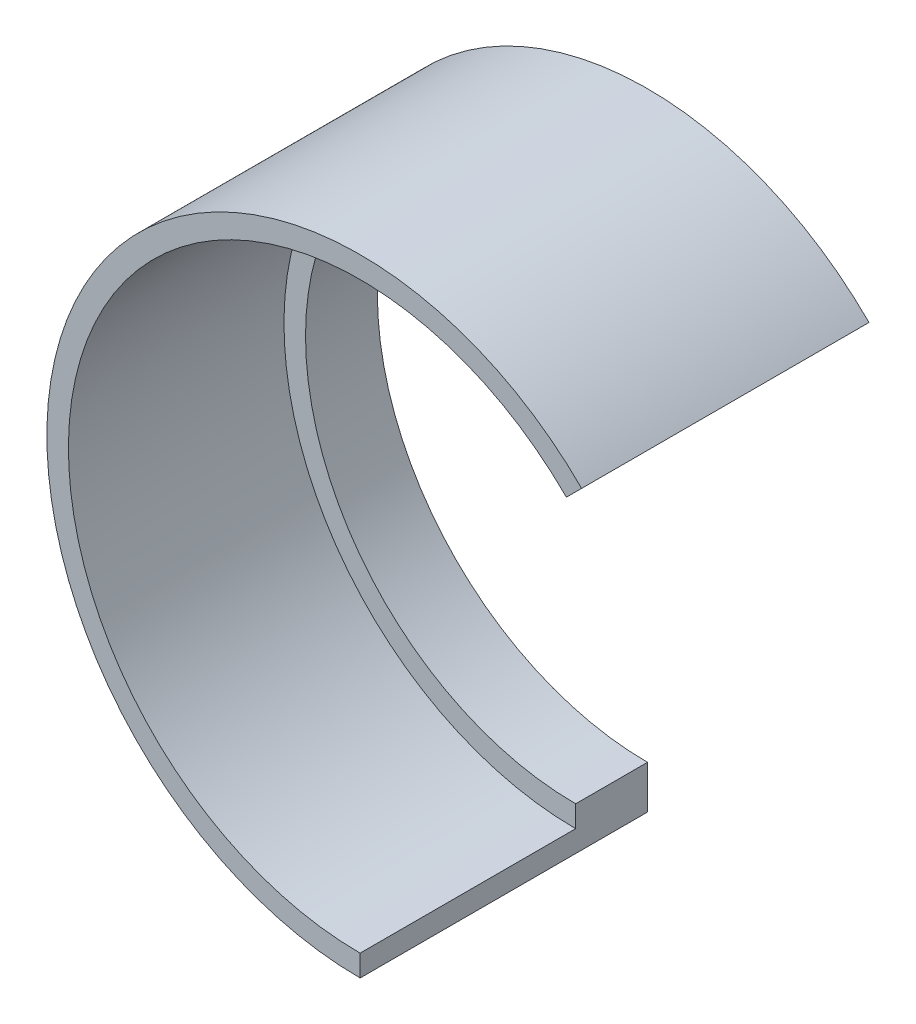
ISO-10303-21;
HEADER;
FILE_DESCRIPTION(('STEP AP214'),'2;1');
FILE_NAME('part.step','',(''),(''),'','','');
FILE_SCHEMA(('AUTOMOTIVE_DESIGN { 1 0 10303 214 1 1 1 1 }'));
ENDSEC;
DATA;
#1=APPLICATION_CONTEXT('core data for automotive mechanical design processes');
#2=APPLICATION_PROTOCOL_DEFINITION('international standard','automotive_design',2000,#1);
#3=PRODUCT_CONTEXT('',#1,'mechanical');
#4=PRODUCT('Part','Part','',(#3));
#5=PRODUCT_RELATED_PRODUCT_CATEGORY('part','',(#4));
#6=PRODUCT_DEFINITION_FORMATION('','',#4);
#7=PRODUCT_DEFINITION_CONTEXT('part definition',#1,'design');
#8=PRODUCT_DEFINITION('design','',#6,#7);
#9=PRODUCT_DEFINITION_SHAPE('','',#8);
#10=(LENGTH_UNIT() NAMED_UNIT(*) SI_UNIT(.MILLI.,.METRE.));
#11=(NAMED_UNIT(*) PLANE_ANGLE_UNIT() SI_UNIT($,.RADIAN.));
#12=(NAMED_UNIT(*) SI_UNIT($,.STERADIAN.) SOLID_ANGLE_UNIT());
#13=UNCERTAINTY_MEASURE_WITH_UNIT(LENGTH_MEASURE(1.E-05),#10,'distance_accuracy_value','');
#14=(GEOMETRIC_REPRESENTATION_CONTEXT(3) GLOBAL_UNCERTAINTY_ASSIGNED_CONTEXT((#13)) GLOBAL_UNIT_ASSIGNED_CONTEXT((#10,
#11,#12)) REPRESENTATION_CONTEXT('',''));
#15=CARTESIAN_POINT('',(0.,0.,0.));
#16=DIRECTION('',(0.,0.,1.));
#17=DIRECTION('',(1.,0.,0.));
#18=AXIS2_PLACEMENT_3D('',#15,#16,#17);
#19=CARTESIAN_POINT('',(0.,0.,10.));
#20=DIRECTION('',(-0.707106781186551,0.707106781186544,0.));
#21=DIRECTION('',(-0.707106781186544,-0.707106781186551,0.));
#22=AXIS2_PLACEMENT_3D('',#19,#20,#21);
#23=PLANE('',#22);
#24=DIRECTION('',(0.707106781186544,0.707106781186551,0.));
#25=VECTOR('',#24,1.);
#26=CARTESIAN_POINT('',(0.,0.,0.));
#27=LINE('',#26,#25);
#28=CARTESIAN_POINT('',(26.587214972614,26.5872149726143,0.));
#29=VERTEX_POINT('',#28);
#30=CARTESIAN_POINT('',(30.8298556597333,30.8298556597336,0.));
#31=VERTEX_POINT('',#30);
#32=EDGE_CURVE('E74',#29,#31,#27,.T.);
#33=ORIENTED_EDGE('',*,*,#32,.T.);
#34=DIRECTION('',(0.,0.,1.));
#35=VECTOR('',#34,1.);
#36=CARTESIAN_POINT('',(30.8298556597333,30.8298556597336,-114.645730027458));
#37=LINE('',#36,#35);
#38=CARTESIAN_POINT('',(30.8298556597333,30.8298556597336,40.));
#39=VERTEX_POINT('',#38);
#40=EDGE_CURVE('E116',#31,#39,#37,.T.);
#41=ORIENTED_EDGE('',*,*,#40,.T.);
#42=DIRECTION('',(0.707106781186543,0.707106781186552,0.));
#43=VECTOR('',#42,1.);
#44=CARTESIAN_POINT('',(0.,0.,40.));
#45=LINE('',#44,#43);
#46=CARTESIAN_POINT('',(28.7085353161737,28.708535316174,40.));
#47=VERTEX_POINT('',#46);
#48=EDGE_CURVE('E222',#47,#39,#45,.T.);
#49=ORIENTED_EDGE('',*,*,#48,.F.);
#50=DIRECTION('',(0.,0.,1.));
#51=VECTOR('',#50,1.);
#52=CARTESIAN_POINT('',(28.7085353161737,28.708535316174,-114.645730027458));
#53=LINE('',#52,#51);
#54=CARTESIAN_POINT('',(28.7085353161737,28.708535316174,10.));
#55=VERTEX_POINT('',#54);
#56=EDGE_CURVE('E110',#55,#47,#53,.T.);
#57=ORIENTED_EDGE('',*,*,#56,.F.);
#58=DIRECTION('',(0.707106781186544,0.707106781186551,0.));
#59=VECTOR('',#58,1.);
#60=CARTESIAN_POINT('',(0.,0.,10.));
#61=LINE('',#60,#59);
#62=CARTESIAN_POINT('',(26.587214972614,26.5872149726143,10.));
#63=VERTEX_POINT('',#62);
#64=EDGE_CURVE('E91',#63,#55,#61,.T.);
#65=ORIENTED_EDGE('',*,*,#64,.F.);
#66=DIRECTION('',(0.,0.,-1.));
#67=VECTOR('',#66,1.);
#68=CARTESIAN_POINT('',(26.587214972614,26.5872149726143,10.));
#69=LINE('',#68,#67);
#70=EDGE_CURVE('E51',#63,#29,#69,.T.);
#71=ORIENTED_EDGE('',*,*,#70,.T.);
#72=EDGE_LOOP('',(#33,#41,#49,#57,#65,#71));
#73=FACE_BOUND('',#72,.T.);
#74=ADVANCED_FACE('F43',(#73),#23,.F.);
#75=CARTESIAN_POINT('',(0.,0.,10.));
#76=DIRECTION('',(1.,0.,0.));
#77=DIRECTION('',(0.,0.,-1.));
#78=AXIS2_PLACEMENT_3D('',#75,#76,#77);
#79=PLANE('',#78);
#80=DIRECTION('',(0.,-1.,0.));
#81=VECTOR('',#80,1.);
#82=CARTESIAN_POINT('',(0.,0.,0.));
#83=LINE('',#82,#81);
#84=CARTESIAN_POINT('',(0.,-37.6,0.));
#85=VERTEX_POINT('',#84);
#86=CARTESIAN_POINT('',(0.,-43.6,0.));
#87=VERTEX_POINT('',#86);
#88=EDGE_CURVE('E126',#85,#87,#83,.T.);
#89=ORIENTED_EDGE('',*,*,#88,.F.);
#90=DIRECTION('',(0.,0.,-1.));
#91=VECTOR('',#90,1.);
#92=CARTESIAN_POINT('',(0.,-37.6,10.));
#93=LINE('',#92,#91);
#94=CARTESIAN_POINT('',(0.,-37.6,10.));
#95=VERTEX_POINT('',#94);
#96=EDGE_CURVE('E11',#95,#85,#93,.T.);
#97=ORIENTED_EDGE('',*,*,#96,.F.);
#98=DIRECTION('',(0.,-1.,0.));
#99=VECTOR('',#98,1.);
#100=CARTESIAN_POINT('',(0.,0.,10.));
#101=LINE('',#100,#99);
#102=CARTESIAN_POINT('',(0.,-40.6,10.));
#103=VERTEX_POINT('',#102);
#104=EDGE_CURVE('E90',#95,#103,#101,.T.);
#105=ORIENTED_EDGE('',*,*,#104,.T.);
#106=DIRECTION('',(0.,0.,1.));
#107=VECTOR('',#106,1.);
#108=CARTESIAN_POINT('',(0.,-40.6,-114.645730027458));
#109=LINE('',#108,#107);
#110=CARTESIAN_POINT('',(0.,-40.6,40.));
#111=VERTEX_POINT('',#110);
#112=EDGE_CURVE('E102',#103,#111,#109,.T.);
#113=ORIENTED_EDGE('',*,*,#112,.T.);
#114=DIRECTION('',(0.,-1.,0.));
#115=VECTOR('',#114,1.);
#116=CARTESIAN_POINT('',(0.,0.,40.));
#117=LINE('',#116,#115);
#118=CARTESIAN_POINT('',(0.,-43.6,40.));
#119=VERTEX_POINT('',#118);
#120=EDGE_CURVE('E228',#111,#119,#117,.T.);
#121=ORIENTED_EDGE('',*,*,#120,.T.);
#122=DIRECTION('',(0.,0.,1.));
#123=VECTOR('',#122,1.);
#124=CARTESIAN_POINT('',(0.,-43.6,-114.645730027458));
#125=LINE('',#124,#123);
#126=EDGE_CURVE('E111',#87,#119,#125,.T.);
#127=ORIENTED_EDGE('',*,*,#126,.F.);
#128=EDGE_LOOP('',(#89,#97,#105,#113,#121,#127));
#129=FACE_BOUND('',#128,.T.);
#130=ADVANCED_FACE('F99',(#129),#79,.T.);
#131=CARTESIAN_POINT('',(0.,0.,10.));
#132=DIRECTION('',(0.,0.,-1.));
#133=DIRECTION('',(-1.,0.,0.));
#134=AXIS2_PLACEMENT_3D('',#131,#132,#133);
#135=CYLINDRICAL_SURFACE('',#134,37.6);
#136=CARTESIAN_POINT('',(0.,0.,0.));
#137=DIRECTION('',(0.,0.,1.));
#138=DIRECTION('',(1.,0.,0.));
#139=AXIS2_PLACEMENT_3D('',#136,#137,#138);
#140=CIRCLE('',#139,37.6);
#141=EDGE_CURVE('E122',#29,#85,#140,.T.);
#142=ORIENTED_EDGE('',*,*,#141,.F.);
#143=ORIENTED_EDGE('',*,*,#70,.F.);
#144=CARTESIAN_POINT('',(0.,0.,10.));
#145=DIRECTION('',(0.,0.,1.));
#146=DIRECTION('',(1.,0.,0.));
#147=AXIS2_PLACEMENT_3D('',#144,#145,#146);
#148=CIRCLE('',#147,37.6);
#149=EDGE_CURVE('E104',#63,#95,#148,.T.);
#150=ORIENTED_EDGE('',*,*,#149,.T.);
#151=ORIENTED_EDGE('',*,*,#96,.T.);
#152=EDGE_LOOP('',(#142,#143,#150,#151));
#153=FACE_BOUND('',#152,.T.);
#154=ADVANCED_FACE('F133',(#153),#135,.F.);
#155=CARTESIAN_POINT('',(0.,0.,10.));
#156=DIRECTION('',(0.,0.,1.));
#157=DIRECTION('',(1.,0.,0.));
#158=AXIS2_PLACEMENT_3D('',#155,#156,#157);
#159=PLANE('',#158);
#160=ORIENTED_EDGE('',*,*,#64,.T.);
#161=CARTESIAN_POINT('',(0.,0.,10.));
#162=DIRECTION('',(0.,0.,1.));
#163=DIRECTION('',(1.,0.,0.));
#164=AXIS2_PLACEMENT_3D('',#161,#162,#163);
#165=CIRCLE('',#164,40.6);
#166=EDGE_CURVE('E86',#55,#103,#165,.T.);
#167=ORIENTED_EDGE('',*,*,#166,.T.);
#168=ORIENTED_EDGE('',*,*,#104,.F.);
#169=ORIENTED_EDGE('',*,*,#149,.F.);
#170=EDGE_LOOP('',(#160,#167,#168,#169));
#171=FACE_BOUND('',#170,.T.);
#172=ADVANCED_FACE('F88',(#171),#159,.T.);
#173=CARTESIAN_POINT('',(0.,0.,0.));
#174=DIRECTION('',(0.,0.,1.));
#175=DIRECTION('',(1.,0.,0.));
#176=AXIS2_PLACEMENT_3D('',#173,#174,#175);
#177=PLANE('',#176);
#178=ORIENTED_EDGE('',*,*,#32,.F.);
#179=ORIENTED_EDGE('',*,*,#141,.T.);
#180=ORIENTED_EDGE('',*,*,#88,.T.);
#181=CARTESIAN_POINT('',(0.,0.,0.));
#182=DIRECTION('',(0.,0.,1.));
#183=DIRECTION('',(1.,0.,0.));
#184=AXIS2_PLACEMENT_3D('',#181,#182,#183);
#185=CIRCLE('',#184,43.6);
#186=EDGE_CURVE('E113',#87,#31,#185,.F.);
#187=ORIENTED_EDGE('',*,*,#186,.T.);
#188=EDGE_LOOP('',(#178,#179,#180,#187));
#189=FACE_BOUND('',#188,.T.);
#190=ADVANCED_FACE('F130',(#189),#177,.F.);
#191=CARTESIAN_POINT('',(0.,0.,-114.645730027458));
#192=DIRECTION('',(0.,0.,1.));
#193=DIRECTION('',(1.,0.,0.));
#194=AXIS2_PLACEMENT_3D('',#191,#192,#193);
#195=CYLINDRICAL_SURFACE('',#194,40.6);
#196=ORIENTED_EDGE('',*,*,#166,.F.);
#197=ORIENTED_EDGE('',*,*,#56,.T.);
#198=CARTESIAN_POINT('',(0.,0.,40.));
#199=DIRECTION('',(0.,0.,1.));
#200=DIRECTION('',(1.,0.,0.));
#201=AXIS2_PLACEMENT_3D('',#198,#199,#200);
#202=CIRCLE('',#201,40.6);
#203=EDGE_CURVE('E109',#47,#111,#202,.T.);
#204=ORIENTED_EDGE('',*,*,#203,.T.);
#205=ORIENTED_EDGE('',*,*,#112,.F.);
#206=EDGE_LOOP('',(#196,#197,#204,#205));
#207=FACE_BOUND('',#206,.T.);
#208=ADVANCED_FACE('F107',(#207),#195,.F.);
#209=CARTESIAN_POINT('',(0.,0.,-114.645730027458));
#210=DIRECTION('',(0.,0.,1.));
#211=DIRECTION('',(1.,0.,0.));
#212=AXIS2_PLACEMENT_3D('',#209,#210,#211);
#213=CYLINDRICAL_SURFACE('',#212,43.6);
#214=ORIENTED_EDGE('',*,*,#186,.F.);
#215=ORIENTED_EDGE('',*,*,#126,.T.);
#216=CARTESIAN_POINT('',(0.,0.,40.));
#217=DIRECTION('',(0.,0.,1.));
#218=DIRECTION('',(1.,0.,0.));
#219=AXIS2_PLACEMENT_3D('',#216,#217,#218);
#220=CIRCLE('',#219,43.6);
#221=EDGE_CURVE('E225',#39,#119,#220,.T.);
#222=ORIENTED_EDGE('',*,*,#221,.F.);
#223=ORIENTED_EDGE('',*,*,#40,.F.);
#224=EDGE_LOOP('',(#214,#215,#222,#223));
#225=FACE_BOUND('',#224,.T.);
#226=ADVANCED_FACE('F169',(#225),#213,.T.);
#227=CARTESIAN_POINT('',(0.,0.,40.));
#228=DIRECTION('',(0.,0.,1.));
#229=DIRECTION('',(1.,0.,0.));
#230=AXIS2_PLACEMENT_3D('',#227,#228,#229);
#231=PLANE('',#230);
#232=ORIENTED_EDGE('',*,*,#48,.T.);
#233=ORIENTED_EDGE('',*,*,#221,.T.);
#234=ORIENTED_EDGE('',*,*,#120,.F.);
#235=ORIENTED_EDGE('',*,*,#203,.F.);
#236=EDGE_LOOP('',(#232,#233,#234,#235));
#237=FACE_BOUND('',#236,.T.);
#238=ADVANCED_FACE('F176',(#237),#231,.T.);
#239=CLOSED_SHELL('',(#74,#130,#154,#172,#190,#208,#226,#238));
#240=MANIFOLD_SOLID_BREP('B2',#239);
#241=ADVANCED_BREP_SHAPE_REPRESENTATION('',(#18,#240),#14);
#242=SHAPE_DEFINITION_REPRESENTATION(#9,#241);
ENDSEC;
END-ISO-10303-21;
